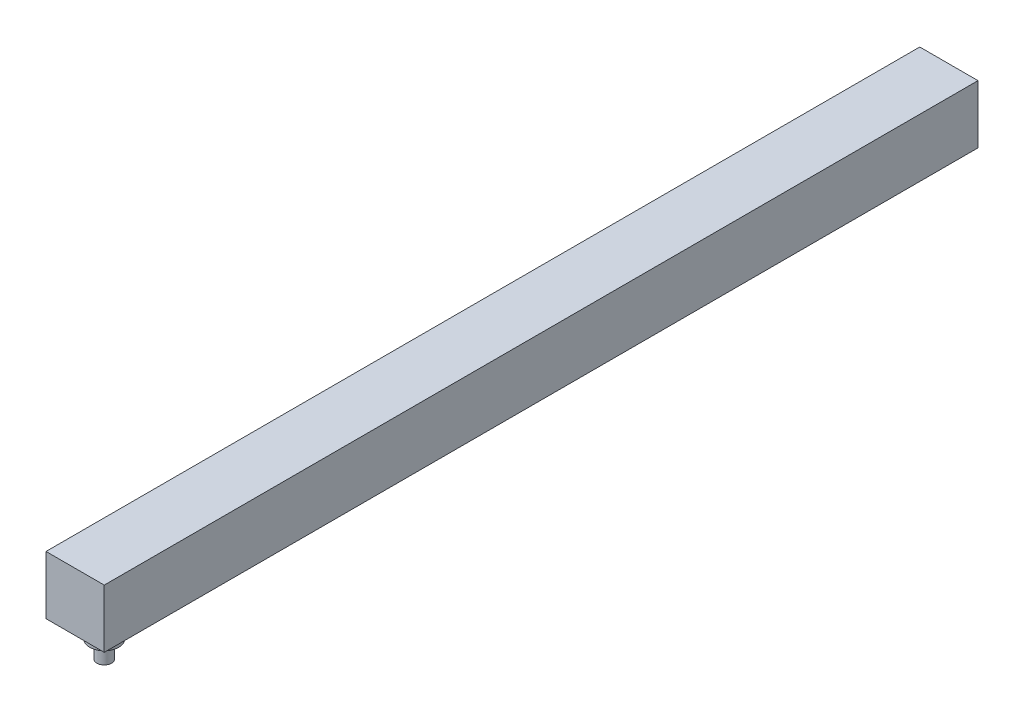
ISO-10303-21;
HEADER;
FILE_DESCRIPTION(('STEP AP214'),'2;1');
FILE_NAME('part.step','',(''),(''),'','','');
FILE_SCHEMA(('AUTOMOTIVE_DESIGN { 1 0 10303 214 1 1 1 1 }'));
ENDSEC;
DATA;
#1=APPLICATION_CONTEXT('core data for automotive mechanical design processes');
#2=APPLICATION_PROTOCOL_DEFINITION('international standard','automotive_design',2000,#1);
#3=PRODUCT_CONTEXT('',#1,'mechanical');
#4=PRODUCT('Part','Part','',(#3));
#5=PRODUCT_RELATED_PRODUCT_CATEGORY('part','',(#4));
#6=PRODUCT_DEFINITION_FORMATION('','',#4);
#7=PRODUCT_DEFINITION_CONTEXT('part definition',#1,'design');
#8=PRODUCT_DEFINITION('design','',#6,#7);
#9=PRODUCT_DEFINITION_SHAPE('','',#8);
#10=(LENGTH_UNIT() NAMED_UNIT(*) SI_UNIT(.MILLI.,.METRE.));
#11=(NAMED_UNIT(*) PLANE_ANGLE_UNIT() SI_UNIT($,.RADIAN.));
#12=(NAMED_UNIT(*) SI_UNIT($,.STERADIAN.) SOLID_ANGLE_UNIT());
#13=UNCERTAINTY_MEASURE_WITH_UNIT(LENGTH_MEASURE(1.E-05),#10,'distance_accuracy_value','');
#14=(GEOMETRIC_REPRESENTATION_CONTEXT(3) GLOBAL_UNCERTAINTY_ASSIGNED_CONTEXT((#13)) GLOBAL_UNIT_ASSIGNED_CONTEXT((#10,
#11,#12)) REPRESENTATION_CONTEXT('',''));
#15=CARTESIAN_POINT('',(0.,0.,0.));
#16=DIRECTION('',(0.,0.,1.));
#17=DIRECTION('',(1.,0.,0.));
#18=AXIS2_PLACEMENT_3D('',#15,#16,#17);
#19=CARTESIAN_POINT('',(0.,0.,150.));
#20=DIRECTION('',(1.,0.,0.));
#21=DIRECTION('',(0.,1.,0.));
#22=AXIS2_PLACEMENT_3D('',#19,#20,#21);
#23=PLANE('',#22);
#24=DIRECTION('',(0.,-1.,0.));
#25=VECTOR('',#24,1.);
#26=CARTESIAN_POINT('',(0.,0.,0.));
#27=LINE('',#26,#25);
#28=CARTESIAN_POINT('',(0.,0.,0.));
#29=VERTEX_POINT('',#28);
#30=CARTESIAN_POINT('',(0.,-10.,0.));
#31=VERTEX_POINT('',#30);
#32=EDGE_CURVE('E111',#29,#31,#27,.T.);
#33=ORIENTED_EDGE('',*,*,#32,.T.);
#34=DIRECTION('',(0.,0.,-1.));
#35=VECTOR('',#34,1.);
#36=CARTESIAN_POINT('',(0.,-10.,150.));
#37=LINE('',#36,#35);
#38=CARTESIAN_POINT('',(0.,-10.,150.));
#39=VERTEX_POINT('',#38);
#40=EDGE_CURVE('E49',#39,#31,#37,.T.);
#41=ORIENTED_EDGE('',*,*,#40,.F.);
#42=DIRECTION('',(0.,-1.,0.));
#43=VECTOR('',#42,1.);
#44=CARTESIAN_POINT('',(0.,0.,150.));
#45=LINE('',#44,#43);
#46=CARTESIAN_POINT('',(0.,0.,150.));
#47=VERTEX_POINT('',#46);
#48=EDGE_CURVE('E93',#47,#39,#45,.T.);
#49=ORIENTED_EDGE('',*,*,#48,.F.);
#50=DIRECTION('',(0.,0.,-1.));
#51=VECTOR('',#50,1.);
#52=CARTESIAN_POINT('',(0.,0.,150.));
#53=LINE('',#52,#51);
#54=EDGE_CURVE('E107',#47,#29,#53,.T.);
#55=ORIENTED_EDGE('',*,*,#54,.T.);
#56=EDGE_LOOP('',(#33,#41,#49,#55));
#57=FACE_BOUND('',#56,.T.);
#58=ADVANCED_FACE('F39',(#57),#23,.F.);
#59=CARTESIAN_POINT('',(0.,-10.,150.));
#60=DIRECTION('',(0.,1.,0.));
#61=DIRECTION('',(0.,0.,1.));
#62=AXIS2_PLACEMENT_3D('',#59,#60,#61);
#63=PLANE('',#62);
#64=CARTESIAN_POINT('',(5.,-10.,145.));
#65=DIRECTION('',(0.,1.,0.));
#66=DIRECTION('',(0.,0.,1.));
#67=AXIS2_PLACEMENT_3D('',#64,#65,#66);
#68=CIRCLE('',#67,2.5);
#69=CARTESIAN_POINT('',(5.,-10.,147.5));
#70=VERTEX_POINT('',#69);
#71=EDGE_CURVE('E11',#70,#70,#68,.F.);
#72=ORIENTED_EDGE('',*,*,#71,.F.);
#73=EDGE_LOOP('',(#72));
#74=FACE_BOUND('',#73,.T.);
#75=DIRECTION('',(1.,0.,0.));
#76=VECTOR('',#75,1.);
#77=CARTESIAN_POINT('',(0.,-10.,0.));
#78=LINE('',#77,#76);
#79=CARTESIAN_POINT('',(10.,-10.,0.));
#80=VERTEX_POINT('',#79);
#81=EDGE_CURVE('E99',#31,#80,#78,.T.);
#82=ORIENTED_EDGE('',*,*,#81,.T.);
#83=DIRECTION('',(0.,0.,-1.));
#84=VECTOR('',#83,1.);
#85=CARTESIAN_POINT('',(10.,-10.,150.));
#86=LINE('',#85,#84);
#87=CARTESIAN_POINT('',(10.,-10.,150.));
#88=VERTEX_POINT('',#87);
#89=EDGE_CURVE('E97',#88,#80,#86,.T.);
#90=ORIENTED_EDGE('',*,*,#89,.F.);
#91=DIRECTION('',(1.,0.,0.));
#92=VECTOR('',#91,1.);
#93=CARTESIAN_POINT('',(0.,-10.,150.));
#94=LINE('',#93,#92);
#95=EDGE_CURVE('E88',#39,#88,#94,.T.);
#96=ORIENTED_EDGE('',*,*,#95,.F.);
#97=ORIENTED_EDGE('',*,*,#40,.T.);
#98=EDGE_LOOP('',(#82,#90,#96,#97));
#99=FACE_BOUND('',#98,.T.);
#100=ADVANCED_FACE('F98',(#74,#99),#63,.F.);
#101=CARTESIAN_POINT('',(10.,0.,150.));
#102=DIRECTION('',(-1.,0.,0.));
#103=DIRECTION('',(0.,-1.,0.));
#104=AXIS2_PLACEMENT_3D('',#101,#102,#103);
#105=PLANE('',#104);
#106=DIRECTION('',(0.,1.,0.));
#107=VECTOR('',#106,1.);
#108=CARTESIAN_POINT('',(10.,0.,0.));
#109=LINE('',#108,#107);
#110=CARTESIAN_POINT('',(10.,0.,0.));
#111=VERTEX_POINT('',#110);
#112=EDGE_CURVE('E74',#80,#111,#109,.T.);
#113=ORIENTED_EDGE('',*,*,#112,.T.);
#114=DIRECTION('',(0.,0.,-1.));
#115=VECTOR('',#114,1.);
#116=CARTESIAN_POINT('',(10.,0.,150.));
#117=LINE('',#116,#115);
#118=CARTESIAN_POINT('',(10.,0.,150.));
#119=VERTEX_POINT('',#118);
#120=EDGE_CURVE('E101',#119,#111,#117,.T.);
#121=ORIENTED_EDGE('',*,*,#120,.F.);
#122=DIRECTION('',(0.,1.,0.));
#123=VECTOR('',#122,1.);
#124=CARTESIAN_POINT('',(10.,0.,150.));
#125=LINE('',#124,#123);
#126=EDGE_CURVE('E91',#88,#119,#125,.T.);
#127=ORIENTED_EDGE('',*,*,#126,.F.);
#128=ORIENTED_EDGE('',*,*,#89,.T.);
#129=EDGE_LOOP('',(#113,#121,#127,#128));
#130=FACE_BOUND('',#129,.T.);
#131=ADVANCED_FACE('F103',(#130),#105,.F.);
#132=CARTESIAN_POINT('',(0.,0.,150.));
#133=DIRECTION('',(0.,-1.,0.));
#134=DIRECTION('',(0.,0.,-1.));
#135=AXIS2_PLACEMENT_3D('',#132,#133,#134);
#136=PLANE('',#135);
#137=DIRECTION('',(-1.,0.,0.));
#138=VECTOR('',#137,1.);
#139=CARTESIAN_POINT('',(0.,0.,0.));
#140=LINE('',#139,#138);
#141=EDGE_CURVE('E80',#111,#29,#140,.T.);
#142=ORIENTED_EDGE('',*,*,#141,.T.);
#143=ORIENTED_EDGE('',*,*,#54,.F.);
#144=DIRECTION('',(-1.,0.,0.));
#145=VECTOR('',#144,1.);
#146=CARTESIAN_POINT('',(0.,0.,150.));
#147=LINE('',#146,#145);
#148=EDGE_CURVE('E57',#119,#47,#147,.T.);
#149=ORIENTED_EDGE('',*,*,#148,.F.);
#150=ORIENTED_EDGE('',*,*,#120,.T.);
#151=EDGE_LOOP('',(#142,#143,#149,#150));
#152=FACE_BOUND('',#151,.T.);
#153=ADVANCED_FACE('F141',(#152),#136,.F.);
#154=CARTESIAN_POINT('',(0.,0.,150.));
#155=DIRECTION('',(0.,0.,1.));
#156=DIRECTION('',(1.,0.,0.));
#157=AXIS2_PLACEMENT_3D('',#154,#155,#156);
#158=PLANE('',#157);
#159=ORIENTED_EDGE('',*,*,#48,.T.);
#160=ORIENTED_EDGE('',*,*,#95,.T.);
#161=ORIENTED_EDGE('',*,*,#126,.T.);
#162=ORIENTED_EDGE('',*,*,#148,.T.);
#163=EDGE_LOOP('',(#159,#160,#161,#162));
#164=FACE_BOUND('',#163,.T.);
#165=ADVANCED_FACE('F89',(#164),#158,.T.);
#166=CARTESIAN_POINT('',(0.,0.,0.));
#167=DIRECTION('',(0.,0.,1.));
#168=DIRECTION('',(1.,0.,0.));
#169=AXIS2_PLACEMENT_3D('',#166,#167,#168);
#170=PLANE('',#169);
#171=ORIENTED_EDGE('',*,*,#32,.F.);
#172=ORIENTED_EDGE('',*,*,#141,.F.);
#173=ORIENTED_EDGE('',*,*,#112,.F.);
#174=ORIENTED_EDGE('',*,*,#81,.F.);
#175=EDGE_LOOP('',(#171,#172,#173,#174));
#176=FACE_BOUND('',#175,.T.);
#177=ADVANCED_FACE('F130',(#176),#170,.F.);
#178=CARTESIAN_POINT('',(5.,-13.,145.));
#179=DIRECTION('',(0.,1.,0.));
#180=DIRECTION('',(0.,0.,1.));
#181=AXIS2_PLACEMENT_3D('',#178,#179,#180);
#182=CYLINDRICAL_SURFACE('',#181,2.5);
#183=CARTESIAN_POINT('',(5.,-13.,145.));
#184=DIRECTION('',(0.,-1.,0.));
#185=DIRECTION('',(0.,0.,-1.));
#186=AXIS2_PLACEMENT_3D('',#183,#184,#185);
#187=CIRCLE('',#186,2.5);
#188=CARTESIAN_POINT('',(5.,-13.,142.5));
#189=VERTEX_POINT('',#188);
#190=EDGE_CURVE('E115',#189,#189,#187,.T.);
#191=ORIENTED_EDGE('',*,*,#190,.F.);
#192=EDGE_LOOP('',(#191));
#193=FACE_BOUND('',#192,.T.);
#194=ORIENTED_EDGE('',*,*,#71,.T.);
#195=EDGE_LOOP('',(#194));
#196=FACE_BOUND('',#195,.T.);
#197=ADVANCED_FACE('F132',(#193,#196),#182,.T.);
#198=CARTESIAN_POINT('',(5.,-13.,145.));
#199=DIRECTION('',(0.,-1.,0.));
#200=DIRECTION('',(0.,0.,-1.));
#201=AXIS2_PLACEMENT_3D('',#198,#199,#200);
#202=PLANE('',#201);
#203=CARTESIAN_POINT('',(5.,-13.,145.));
#204=DIRECTION('',(0.,-1.,0.));
#205=DIRECTION('',(0.,0.,-1.));
#206=AXIS2_PLACEMENT_3D('',#203,#204,#205);
#207=CIRCLE('',#206,1.25);
#208=CARTESIAN_POINT('',(5.,-13.,143.75));
#209=VERTEX_POINT('',#208);
#210=EDGE_CURVE('E42',#209,#209,#207,.F.);
#211=ORIENTED_EDGE('',*,*,#210,.T.);
#212=EDGE_LOOP('',(#211));
#213=FACE_BOUND('',#212,.T.);
#214=ORIENTED_EDGE('',*,*,#190,.T.);
#215=EDGE_LOOP('',(#214));
#216=FACE_BOUND('',#215,.T.);
#217=ADVANCED_FACE('F138',(#213,#216),#202,.T.);
#218=CARTESIAN_POINT('',(5.,-16.,145.));
#219=DIRECTION('',(0.,1.,0.));
#220=DIRECTION('',(0.,0.,1.));
#221=AXIS2_PLACEMENT_3D('',#218,#219,#220);
#222=CYLINDRICAL_SURFACE('',#221,1.25);
#223=ORIENTED_EDGE('',*,*,#210,.F.);
#224=EDGE_LOOP('',(#223));
#225=FACE_BOUND('',#224,.T.);
#226=CARTESIAN_POINT('',(5.,-16.,145.));
#227=DIRECTION('',(0.,-1.,0.));
#228=DIRECTION('',(0.,0.,-1.));
#229=AXIS2_PLACEMENT_3D('',#226,#227,#228);
#230=CIRCLE('',#229,1.25);
#231=CARTESIAN_POINT('',(5.,-16.,143.75));
#232=VERTEX_POINT('',#231);
#233=EDGE_CURVE('E214',#232,#232,#230,.T.);
#234=ORIENTED_EDGE('',*,*,#233,.F.);
#235=EDGE_LOOP('',(#234));
#236=FACE_BOUND('',#235,.T.);
#237=ADVANCED_FACE('F188',(#225,#236),#222,.T.);
#238=CARTESIAN_POINT('',(5.,-16.,145.));
#239=DIRECTION('',(0.,-1.,0.));
#240=DIRECTION('',(0.,0.,-1.));
#241=AXIS2_PLACEMENT_3D('',#238,#239,#240);
#242=PLANE('',#241);
#243=ORIENTED_EDGE('',*,*,#233,.T.);
#244=EDGE_LOOP('',(#243));
#245=FACE_BOUND('',#244,.T.);
#246=ADVANCED_FACE('F198',(#245),#242,.T.);
#247=CLOSED_SHELL('',(#58,#100,#131,#153,#165,#177,#197,#217,#237,#246));
#248=MANIFOLD_SOLID_BREP('B2',#247);
#249=ADVANCED_BREP_SHAPE_REPRESENTATION('',(#18,#248),#14);
#250=SHAPE_DEFINITION_REPRESENTATION(#9,#249);
ENDSEC;
END-ISO-10303-21;
